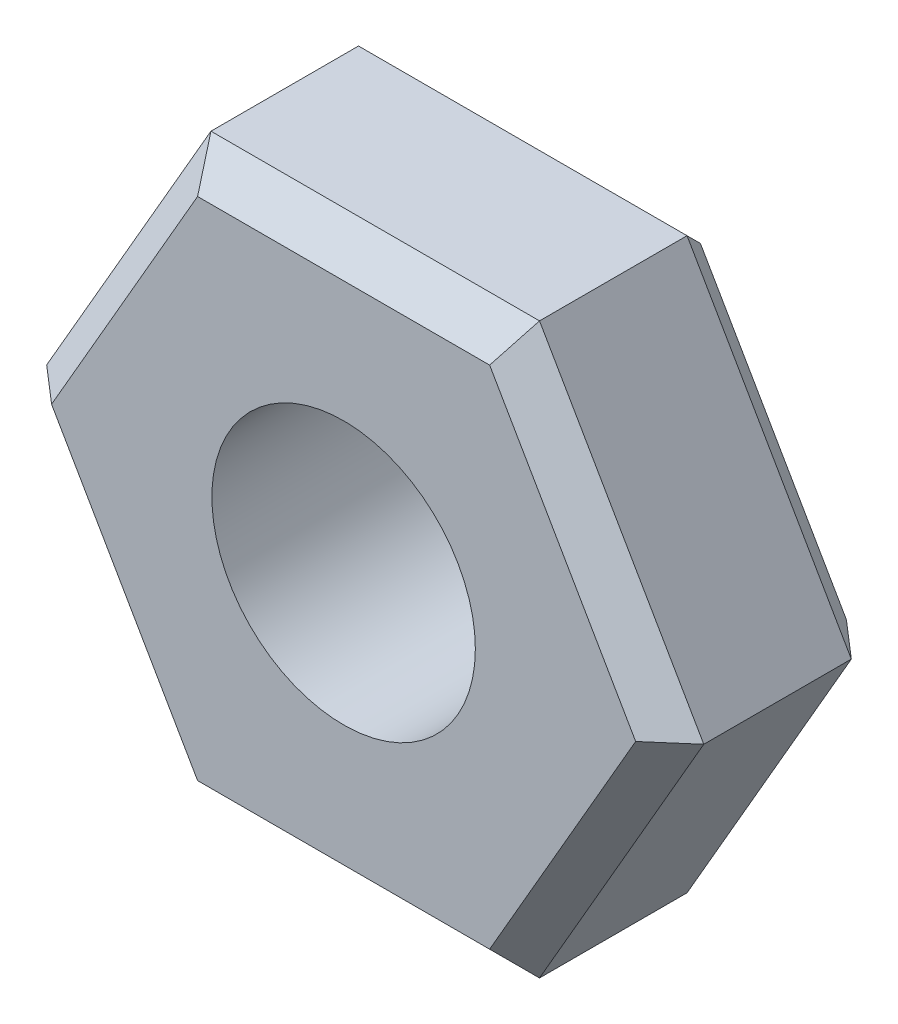
ISO-10303-21;
HEADER;
FILE_DESCRIPTION(('STEP AP214'),'2;1');
FILE_NAME('part.step','',(''),(''),'','','');
FILE_SCHEMA(('AUTOMOTIVE_DESIGN { 1 0 10303 214 1 1 1 1 }'));
ENDSEC;
DATA;
#1=APPLICATION_CONTEXT('core data for automotive mechanical design processes');
#2=APPLICATION_PROTOCOL_DEFINITION('international standard','automotive_design',2000,#1);
#3=PRODUCT_CONTEXT('',#1,'mechanical');
#4=PRODUCT('Part','Part','',(#3));
#5=PRODUCT_RELATED_PRODUCT_CATEGORY('part','',(#4));
#6=PRODUCT_DEFINITION_FORMATION('','',#4);
#7=PRODUCT_DEFINITION_CONTEXT('part definition',#1,'design');
#8=PRODUCT_DEFINITION('design','',#6,#7);
#9=PRODUCT_DEFINITION_SHAPE('','',#8);
#10=(LENGTH_UNIT() NAMED_UNIT(*) SI_UNIT(.MILLI.,.METRE.));
#11=(NAMED_UNIT(*) PLANE_ANGLE_UNIT() SI_UNIT($,.RADIAN.));
#12=(NAMED_UNIT(*) SI_UNIT($,.STERADIAN.) SOLID_ANGLE_UNIT());
#13=UNCERTAINTY_MEASURE_WITH_UNIT(LENGTH_MEASURE(1.E-05),#10,'distance_accuracy_value','');
#14=(GEOMETRIC_REPRESENTATION_CONTEXT(3) GLOBAL_UNCERTAINTY_ASSIGNED_CONTEXT((#13)) GLOBAL_UNIT_ASSIGNED_CONTEXT((#10,
#11,#12)) REPRESENTATION_CONTEXT('',''));
#15=CARTESIAN_POINT('',(0.,0.,0.));
#16=DIRECTION('',(0.,0.,1.));
#17=DIRECTION('',(1.,0.,0.));
#18=AXIS2_PLACEMENT_3D('',#15,#16,#17);
#19=CARTESIAN_POINT('',(0.,0.,1.));
#20=DIRECTION('',(0.,0.,1.));
#21=DIRECTION('',(1.,0.,0.));
#22=AXIS2_PLACEMENT_3D('',#19,#20,#21);
#23=PLANE('',#22);
#24=DIRECTION('',(-1.,0.,0.));
#25=VECTOR('',#24,1.);
#26=CARTESIAN_POINT('',(-1.558845726812,2.39999999999999,1.));
#27=LINE('',#26,#25);
#28=CARTESIAN_POINT('',(1.3856406460551,2.4,1.));
#29=VERTEX_POINT('',#28);
#30=CARTESIAN_POINT('',(-1.38564064605511,2.39999999999999,1.));
#31=VERTEX_POINT('',#30);
#32=EDGE_CURVE('E165',#29,#31,#27,.T.);
#33=ORIENTED_EDGE('',*,*,#32,.T.);
#34=DIRECTION('',(-0.499999999999995,-0.866025403784442,0.));
#35=VECTOR('',#34,1.);
#36=CARTESIAN_POINT('',(-2.85788383248865,-0.15000000000002,1.));
#37=LINE('',#36,#35);
#38=CARTESIAN_POINT('',(-2.7712812921102,0.,1.));
#39=VERTEX_POINT('',#38);
#40=EDGE_CURVE('E11',#31,#39,#37,.T.);
#41=ORIENTED_EDGE('',*,*,#40,.T.);
#42=DIRECTION('',(0.500000000000007,-0.866025403784435,0.));
#43=VECTOR('',#42,1.);
#44=CARTESIAN_POINT('',(-1.29903810567663,-2.55000000000001,1.));
#45=LINE('',#44,#43);
#46=CARTESIAN_POINT('',(-1.38564064605508,-2.40000000000001,1.));
#47=VERTEX_POINT('',#46);
#48=EDGE_CURVE('E48',#39,#47,#45,.T.);
#49=ORIENTED_EDGE('',*,*,#48,.T.);
#50=DIRECTION('',(1.,0.,0.));
#51=VECTOR('',#50,1.);
#52=CARTESIAN_POINT('',(1.55884572681202,-2.39999999999998,1.));
#53=LINE('',#52,#51);
#54=CARTESIAN_POINT('',(1.38564064605513,-2.39999999999998,1.));
#55=VERTEX_POINT('',#54);
#56=EDGE_CURVE('E194',#47,#55,#53,.T.);
#57=ORIENTED_EDGE('',*,*,#56,.T.);
#58=DIRECTION('',(0.499999999999995,0.866025403784441,0.));
#59=VECTOR('',#58,1.);
#60=CARTESIAN_POINT('',(2.85788383248865,0.149999999999999,1.));
#61=LINE('',#60,#59);
#62=CARTESIAN_POINT('',(2.77128129211021,0.,1.));
#63=VERTEX_POINT('',#62);
#64=EDGE_CURVE('E196',#55,#63,#61,.T.);
#65=ORIENTED_EDGE('',*,*,#64,.T.);
#66=DIRECTION('',(-0.500000000000001,0.866025403784438,0.));
#67=VECTOR('',#66,1.);
#68=CARTESIAN_POINT('',(1.29903810567665,2.55,1.));
#69=LINE('',#68,#67);
#70=EDGE_CURVE('E198',#63,#29,#69,.T.);
#71=ORIENTED_EDGE('',*,*,#70,.T.);
#72=EDGE_LOOP('',(#33,#41,#49,#57,#65,#71));
#73=FACE_BOUND('',#72,.T.);
#74=CARTESIAN_POINT('',(0.,0.,1.));
#75=DIRECTION('',(0.,0.,1.));
#76=DIRECTION('',(1.,0.,0.));
#77=AXIS2_PLACEMENT_3D('',#74,#75,#76);
#78=CIRCLE('',#77,1.25);
#79=CARTESIAN_POINT('',(1.25,0.,1.));
#80=VERTEX_POINT('',#79);
#81=EDGE_CURVE('E242',#80,#80,#78,.T.);
#82=ORIENTED_EDGE('',*,*,#81,.F.);
#83=EDGE_LOOP('',(#82));
#84=FACE_BOUND('',#83,.T.);
#85=ADVANCED_FACE('F38',(#73,#84),#23,.T.);
#86=CARTESIAN_POINT('',(0.,0.,-1.));
#87=DIRECTION('',(0.,0.,1.));
#88=DIRECTION('',(1.,0.,0.));
#89=AXIS2_PLACEMENT_3D('',#86,#87,#88);
#90=PLANE('',#89);
#91=DIRECTION('',(1.,0.,0.));
#92=VECTOR('',#91,1.);
#93=CARTESIAN_POINT('',(0.,2.4,-1.));
#94=LINE('',#93,#92);
#95=CARTESIAN_POINT('',(-1.38564064605511,2.39999999999999,-1.));
#96=VERTEX_POINT('',#95);
#97=CARTESIAN_POINT('',(1.3856406460551,2.4,-1.));
#98=VERTEX_POINT('',#97);
#99=EDGE_CURVE('E228',#96,#98,#94,.T.);
#100=ORIENTED_EDGE('',*,*,#99,.T.);
#101=DIRECTION('',(0.500000000000001,-0.866025403784438,0.));
#102=VECTOR('',#101,1.);
#103=CARTESIAN_POINT('',(2.07846096908265,1.2,-1.));
#104=LINE('',#103,#102);
#105=CARTESIAN_POINT('',(2.77128129211021,0.,-1.));
#106=VERTEX_POINT('',#105);
#107=EDGE_CURVE('E217',#98,#106,#104,.T.);
#108=ORIENTED_EDGE('',*,*,#107,.T.);
#109=DIRECTION('',(-0.499999999999995,-0.866025403784441,0.));
#110=VECTOR('',#109,1.);
#111=CARTESIAN_POINT('',(2.07846096908267,-1.19999999999999,-1.));
#112=LINE('',#111,#110);
#113=CARTESIAN_POINT('',(1.38564064605513,-2.39999999999998,-1.));
#114=VERTEX_POINT('',#113);
#115=EDGE_CURVE('E220',#106,#114,#112,.T.);
#116=ORIENTED_EDGE('',*,*,#115,.T.);
#117=DIRECTION('',(-1.,0.,0.));
#118=VECTOR('',#117,1.);
#119=CARTESIAN_POINT('',(0.,-2.4,-1.));
#120=LINE('',#119,#118);
#121=CARTESIAN_POINT('',(-1.38564064605508,-2.40000000000001,-1.));
#122=VERTEX_POINT('',#121);
#123=EDGE_CURVE('E222',#114,#122,#120,.T.);
#124=ORIENTED_EDGE('',*,*,#123,.T.);
#125=DIRECTION('',(-0.500000000000007,0.866025403784435,0.));
#126=VECTOR('',#125,1.);
#127=CARTESIAN_POINT('',(-2.07846096908264,-1.20000000000002,-1.));
#128=LINE('',#127,#126);
#129=CARTESIAN_POINT('',(-2.7712812921102,0.,-1.));
#130=VERTEX_POINT('',#129);
#131=EDGE_CURVE('E224',#122,#130,#128,.T.);
#132=ORIENTED_EDGE('',*,*,#131,.T.);
#133=DIRECTION('',(0.499999999999995,0.866025403784442,0.));
#134=VECTOR('',#133,1.);
#135=CARTESIAN_POINT('',(-2.07846096908266,1.19999999999999,-1.));
#136=LINE('',#135,#134);
#137=EDGE_CURVE('E226',#130,#96,#136,.T.);
#138=ORIENTED_EDGE('',*,*,#137,.T.);
#139=EDGE_LOOP('',(#100,#108,#116,#124,#132,#138));
#140=FACE_BOUND('',#139,.T.);
#141=CARTESIAN_POINT('',(0.,0.,-1.));
#142=DIRECTION('',(0.,0.,1.));
#143=DIRECTION('',(1.,0.,0.));
#144=AXIS2_PLACEMENT_3D('',#141,#142,#143);
#145=CIRCLE('',#144,1.25);
#146=CARTESIAN_POINT('',(1.25,0.,-1.));
#147=VERTEX_POINT('',#146);
#148=EDGE_CURVE('E179',#147,#147,#145,.T.);
#149=ORIENTED_EDGE('',*,*,#148,.T.);
#150=EDGE_LOOP('',(#149));
#151=FACE_BOUND('',#150,.T.);
#152=ADVANCED_FACE('F252',(#140,#151),#90,.F.);
#153=CARTESIAN_POINT('',(1.55884572681202,-2.69999999999998,1.));
#154=DIRECTION('',(-0.866025403784441,0.499999999999995,0.));
#155=DIRECTION('',(-0.499999999999995,-0.866025403784442,0.));
#156=AXIS2_PLACEMENT_3D('',#153,#154,#155);
#157=PLANE('',#156);
#158=DIRECTION('',(0.,0.,-1.));
#159=VECTOR('',#158,1.);
#160=CARTESIAN_POINT('',(1.55884572681202,-2.69999999999998,1.));
#161=LINE('',#160,#159);
#162=CARTESIAN_POINT('',(1.55884572681202,-2.69999999999998,0.699999999999999));
#163=VERTEX_POINT('',#162);
#164=CARTESIAN_POINT('',(1.55884572681202,-2.69999999999998,-0.7));
#165=VERTEX_POINT('',#164);
#166=EDGE_CURVE('E239',#163,#165,#161,.T.);
#167=ORIENTED_EDGE('',*,*,#166,.T.);
#168=DIRECTION('',(0.499999999999995,0.866025403784442,0.));
#169=VECTOR('',#168,1.);
#170=CARTESIAN_POINT('',(1.55884572681202,-2.69999999999998,-0.7));
#171=LINE('',#170,#169);
#172=CARTESIAN_POINT('',(3.11769145362398,0.,-0.7));
#173=VERTEX_POINT('',#172);
#174=EDGE_CURVE('E213',#165,#173,#171,.T.);
#175=ORIENTED_EDGE('',*,*,#174,.T.);
#176=DIRECTION('',(0.,0.,-1.));
#177=VECTOR('',#176,1.);
#178=CARTESIAN_POINT('',(3.11769145362398,0.,1.));
#179=LINE('',#178,#177);
#180=CARTESIAN_POINT('',(3.11769145362398,0.,0.699999999999999));
#181=VERTEX_POINT('',#180);
#182=EDGE_CURVE('E153',#181,#173,#179,.T.);
#183=ORIENTED_EDGE('',*,*,#182,.F.);
#184=DIRECTION('',(-0.499999999999995,-0.866025403784442,0.));
#185=VECTOR('',#184,1.);
#186=CARTESIAN_POINT('',(1.55884572681202,-2.69999999999998,0.699999999999999));
#187=LINE('',#186,#185);
#188=EDGE_CURVE('E215',#181,#163,#187,.T.);
#189=ORIENTED_EDGE('',*,*,#188,.T.);
#190=EDGE_LOOP('',(#167,#175,#183,#189));
#191=FACE_BOUND('',#190,.T.);
#192=ADVANCED_FACE('F257',(#191),#157,.F.);
#193=CARTESIAN_POINT('',(3.11769145362398,0.,1.));
#194=DIRECTION('',(-0.866025403784438,-0.500000000000001,0.));
#195=DIRECTION('',(0.500000000000001,-0.866025403784438,0.));
#196=AXIS2_PLACEMENT_3D('',#193,#194,#195);
#197=PLANE('',#196);
#198=ORIENTED_EDGE('',*,*,#182,.T.);
#199=DIRECTION('',(-0.500000000000001,0.866025403784438,0.));
#200=VECTOR('',#199,1.);
#201=CARTESIAN_POINT('',(3.11769145362398,0.,-0.7));
#202=LINE('',#201,#200);
#203=CARTESIAN_POINT('',(1.55884572681198,2.70000000000001,-0.7));
#204=VERTEX_POINT('',#203);
#205=EDGE_CURVE('E152',#173,#204,#202,.T.);
#206=ORIENTED_EDGE('',*,*,#205,.T.);
#207=DIRECTION('',(0.,0.,-1.));
#208=VECTOR('',#207,1.);
#209=CARTESIAN_POINT('',(1.55884572681198,2.70000000000001,1.));
#210=LINE('',#209,#208);
#211=CARTESIAN_POINT('',(1.55884572681198,2.70000000000001,0.699999999999999));
#212=VERTEX_POINT('',#211);
#213=EDGE_CURVE('E134',#212,#204,#210,.T.);
#214=ORIENTED_EDGE('',*,*,#213,.F.);
#215=DIRECTION('',(0.500000000000001,-0.866025403784438,0.));
#216=VECTOR('',#215,1.);
#217=CARTESIAN_POINT('',(3.11769145362398,0.,0.699999999999999));
#218=LINE('',#217,#216);
#219=EDGE_CURVE('E149',#212,#181,#218,.T.);
#220=ORIENTED_EDGE('',*,*,#219,.T.);
#221=EDGE_LOOP('',(#198,#206,#214,#220));
#222=FACE_BOUND('',#221,.T.);
#223=ADVANCED_FACE('F148',(#222),#197,.F.);
#224=CARTESIAN_POINT('',(1.55884572681198,2.70000000000001,1.));
#225=DIRECTION('',(0.,-1.,0.));
#226=DIRECTION('',(1.,0.,0.));
#227=AXIS2_PLACEMENT_3D('',#224,#225,#226);
#228=PLANE('',#227);
#229=ORIENTED_EDGE('',*,*,#213,.T.);
#230=DIRECTION('',(-1.,0.,0.));
#231=VECTOR('',#230,1.);
#232=CARTESIAN_POINT('',(1.55884572681198,2.70000000000001,-0.7));
#233=LINE('',#232,#231);
#234=CARTESIAN_POINT('',(-1.558845726812,2.69999999999999,-0.7));
#235=VERTEX_POINT('',#234);
#236=EDGE_CURVE('E141',#204,#235,#233,.T.);
#237=ORIENTED_EDGE('',*,*,#236,.T.);
#238=DIRECTION('',(0.,0.,-1.));
#239=VECTOR('',#238,1.);
#240=CARTESIAN_POINT('',(-1.558845726812,2.69999999999999,1.));
#241=LINE('',#240,#239);
#242=CARTESIAN_POINT('',(-1.558845726812,2.69999999999999,0.699999999999999));
#243=VERTEX_POINT('',#242);
#244=EDGE_CURVE('E136',#243,#235,#241,.T.);
#245=ORIENTED_EDGE('',*,*,#244,.F.);
#246=DIRECTION('',(1.,0.,0.));
#247=VECTOR('',#246,1.);
#248=CARTESIAN_POINT('',(1.55884572681198,2.70000000000001,0.699999999999999));
#249=LINE('',#248,#247);
#250=EDGE_CURVE('E131',#243,#212,#249,.T.);
#251=ORIENTED_EDGE('',*,*,#250,.T.);
#252=EDGE_LOOP('',(#229,#237,#245,#251));
#253=FACE_BOUND('',#252,.T.);
#254=ADVANCED_FACE('F133',(#253),#228,.F.);
#255=CARTESIAN_POINT('',(-1.558845726812,2.69999999999999,1.));
#256=DIRECTION('',(0.866025403784442,-0.499999999999995,0.));
#257=DIRECTION('',(0.499999999999995,0.866025403784442,0.));
#258=AXIS2_PLACEMENT_3D('',#255,#256,#257);
#259=PLANE('',#258);
#260=ORIENTED_EDGE('',*,*,#244,.T.);
#261=DIRECTION('',(-0.499999999999995,-0.866025403784442,0.));
#262=VECTOR('',#261,1.);
#263=CARTESIAN_POINT('',(-1.558845726812,2.69999999999999,-0.7));
#264=LINE('',#263,#262);
#265=CARTESIAN_POINT('',(-3.11769145362398,0.,-0.7));
#266=VERTEX_POINT('',#265);
#267=EDGE_CURVE('E142',#235,#266,#264,.T.);
#268=ORIENTED_EDGE('',*,*,#267,.T.);
#269=DIRECTION('',(0.,0.,-1.));
#270=VECTOR('',#269,1.);
#271=CARTESIAN_POINT('',(-3.11769145362398,0.,1.));
#272=LINE('',#271,#270);
#273=CARTESIAN_POINT('',(-3.11769145362398,0.,0.699999999999999));
#274=VERTEX_POINT('',#273);
#275=EDGE_CURVE('E233',#274,#266,#272,.T.);
#276=ORIENTED_EDGE('',*,*,#275,.F.);
#277=DIRECTION('',(0.499999999999995,0.866025403784442,0.));
#278=VECTOR('',#277,1.);
#279=CARTESIAN_POINT('',(-1.558845726812,2.69999999999999,0.699999999999999));
#280=LINE('',#279,#278);
#281=EDGE_CURVE('E203',#274,#243,#280,.T.);
#282=ORIENTED_EDGE('',*,*,#281,.T.);
#283=EDGE_LOOP('',(#260,#268,#276,#282));
#284=FACE_BOUND('',#283,.T.);
#285=ADVANCED_FACE('F269',(#284),#259,.F.);
#286=CARTESIAN_POINT('',(-3.11769145362398,0.,1.));
#287=DIRECTION('',(0.866025403784435,0.500000000000007,0.));
#288=DIRECTION('',(-0.500000000000007,0.866025403784435,0.));
#289=AXIS2_PLACEMENT_3D('',#286,#287,#288);
#290=PLANE('',#289);
#291=ORIENTED_EDGE('',*,*,#275,.T.);
#292=DIRECTION('',(0.500000000000007,-0.866025403784435,0.));
#293=VECTOR('',#292,1.);
#294=CARTESIAN_POINT('',(-3.11769145362398,0.,-0.7));
#295=LINE('',#294,#293);
#296=CARTESIAN_POINT('',(-1.55884572681197,-2.70000000000002,-0.7));
#297=VERTEX_POINT('',#296);
#298=EDGE_CURVE('E205',#266,#297,#295,.T.);
#299=ORIENTED_EDGE('',*,*,#298,.T.);
#300=DIRECTION('',(0.,0.,-1.));
#301=VECTOR('',#300,1.);
#302=CARTESIAN_POINT('',(-1.55884572681197,-2.70000000000002,1.));
#303=LINE('',#302,#301);
#304=CARTESIAN_POINT('',(-1.55884572681197,-2.70000000000002,0.699999999999999));
#305=VERTEX_POINT('',#304);
#306=EDGE_CURVE('E236',#305,#297,#303,.T.);
#307=ORIENTED_EDGE('',*,*,#306,.F.);
#308=DIRECTION('',(-0.500000000000007,0.866025403784435,0.));
#309=VECTOR('',#308,1.);
#310=CARTESIAN_POINT('',(-3.11769145362398,0.,0.699999999999999));
#311=LINE('',#310,#309);
#312=EDGE_CURVE('E207',#305,#274,#311,.T.);
#313=ORIENTED_EDGE('',*,*,#312,.T.);
#314=EDGE_LOOP('',(#291,#299,#307,#313));
#315=FACE_BOUND('',#314,.T.);
#316=ADVANCED_FACE('F265',(#315),#290,.F.);
#317=CARTESIAN_POINT('',(-1.55884572681197,-2.70000000000002,1.));
#318=DIRECTION('',(0.,1.,0.));
#319=DIRECTION('',(-1.,0.,0.));
#320=AXIS2_PLACEMENT_3D('',#317,#318,#319);
#321=PLANE('',#320);
#322=ORIENTED_EDGE('',*,*,#306,.T.);
#323=DIRECTION('',(1.,0.,0.));
#324=VECTOR('',#323,1.);
#325=CARTESIAN_POINT('',(-1.55884572681197,-2.70000000000002,-0.7));
#326=LINE('',#325,#324);
#327=EDGE_CURVE('E209',#297,#165,#326,.T.);
#328=ORIENTED_EDGE('',*,*,#327,.T.);
#329=ORIENTED_EDGE('',*,*,#166,.F.);
#330=DIRECTION('',(-1.,0.,0.));
#331=VECTOR('',#330,1.);
#332=CARTESIAN_POINT('',(-1.55884572681197,-2.70000000000002,0.699999999999999));
#333=LINE('',#332,#331);
#334=EDGE_CURVE('E211',#163,#305,#333,.T.);
#335=ORIENTED_EDGE('',*,*,#334,.T.);
#336=EDGE_LOOP('',(#322,#328,#329,#335));
#337=FACE_BOUND('',#336,.T.);
#338=ADVANCED_FACE('F262',(#337),#321,.F.);
#339=CARTESIAN_POINT('',(0.,0.,1.));
#340=DIRECTION('',(0.,0.,-1.));
#341=DIRECTION('',(-1.,0.,0.));
#342=AXIS2_PLACEMENT_3D('',#339,#340,#341);
#343=CYLINDRICAL_SURFACE('',#342,1.25);
#344=ORIENTED_EDGE('',*,*,#81,.T.);
#345=EDGE_LOOP('',(#344));
#346=FACE_BOUND('',#345,.T.);
#347=ORIENTED_EDGE('',*,*,#148,.F.);
#348=EDGE_LOOP('',(#347));
#349=FACE_BOUND('',#348,.T.);
#350=ADVANCED_FACE('F248',(#346,#349),#343,.F.);
#351=CARTESIAN_POINT('',(-3.11769145362398,0.,-0.7));
#352=DIRECTION('',(0.612372435695791,0.353553390593278,0.707106781186549));
#353=DIRECTION('',(0.500000000000007,-0.866025403784435,0.));
#354=AXIS2_PLACEMENT_3D('',#351,#352,#353);
#355=PLANE('',#354);
#356=DIRECTION('',(-0.755928946018456,0.,0.654653670707976));
#357=VECTOR('',#356,1.);
#358=CARTESIAN_POINT('',(-2.22692246687426,0.,-1.47142857142858));
#359=LINE('',#358,#357);
#360=EDGE_CURVE('E180',#130,#266,#359,.T.);
#361=ORIENTED_EDGE('',*,*,#360,.F.);
#362=ORIENTED_EDGE('',*,*,#131,.F.);
#363=DIRECTION('',(-0.377964473009222,-0.654653670707982,0.654653670707976));
#364=VECTOR('',#363,1.);
#365=CARTESIAN_POINT('',(-1.11346123343711,-1.92857142857144,-1.47142857142857));
#366=LINE('',#365,#364);
#367=EDGE_CURVE('E176',#297,#122,#366,.F.);
#368=ORIENTED_EDGE('',*,*,#367,.F.);
#369=ORIENTED_EDGE('',*,*,#298,.F.);
#370=EDGE_LOOP('',(#361,#362,#368,#369));
#371=FACE_BOUND('',#370,.T.);
#372=ADVANCED_FACE('F316',(#371),#355,.F.);
#373=CARTESIAN_POINT('',(-1.55884572681197,-2.70000000000002,-0.7));
#374=DIRECTION('',(0.,0.707106781186547,0.707106781186549));
#375=DIRECTION('',(1.,0.,0.));
#376=AXIS2_PLACEMENT_3D('',#373,#374,#375);
#377=PLANE('',#376);
#378=ORIENTED_EDGE('',*,*,#367,.T.);
#379=ORIENTED_EDGE('',*,*,#123,.F.);
#380=DIRECTION('',(0.377964473009233,-0.654653670707974,0.654653670707976));
#381=VECTOR('',#380,1.);
#382=CARTESIAN_POINT('',(1.11346123343716,-1.92857142857142,-1.47142857142857));
#383=LINE('',#382,#381);
#384=EDGE_CURVE('E183',#165,#114,#383,.F.);
#385=ORIENTED_EDGE('',*,*,#384,.F.);
#386=ORIENTED_EDGE('',*,*,#327,.F.);
#387=EDGE_LOOP('',(#378,#379,#385,#386));
#388=FACE_BOUND('',#387,.T.);
#389=ADVANCED_FACE('F309',(#388),#377,.F.);
#390=CARTESIAN_POINT('',(-1.558845726812,2.69999999999999,-0.7));
#391=DIRECTION('',(0.612372435695796,-0.35355339059327,0.707106781186548));
#392=DIRECTION('',(-0.499999999999995,-0.866025403784442,0.));
#393=AXIS2_PLACEMENT_3D('',#390,#391,#392);
#394=PLANE('',#393);
#395=ORIENTED_EDGE('',*,*,#360,.T.);
#396=ORIENTED_EDGE('',*,*,#267,.F.);
#397=DIRECTION('',(-0.37796447300923,0.654653670707976,0.654653670707976));
#398=VECTOR('',#397,1.);
#399=CARTESIAN_POINT('',(-1.11346123343714,1.92857142857142,-1.47142857142857));
#400=LINE('',#399,#398);
#401=EDGE_CURVE('E186',#96,#235,#400,.T.);
#402=ORIENTED_EDGE('',*,*,#401,.F.);
#403=ORIENTED_EDGE('',*,*,#137,.F.);
#404=EDGE_LOOP('',(#395,#396,#402,#403));
#405=FACE_BOUND('',#404,.T.);
#406=ADVANCED_FACE('F302',(#405),#394,.F.);
#407=CARTESIAN_POINT('',(1.55884572681202,-2.69999999999998,-0.7));
#408=DIRECTION('',(-0.612372435695795,0.35355339059327,0.707106781186549));
#409=DIRECTION('',(0.499999999999995,0.866025403784442,0.));
#410=AXIS2_PLACEMENT_3D('',#407,#408,#409);
#411=PLANE('',#410);
#412=ORIENTED_EDGE('',*,*,#384,.T.);
#413=ORIENTED_EDGE('',*,*,#115,.F.);
#414=DIRECTION('',(0.755928946018455,0.,0.654653670707976));
#415=VECTOR('',#414,1.);
#416=CARTESIAN_POINT('',(2.22692246687428,0.,-1.47142857142856));
#417=LINE('',#416,#415);
#418=EDGE_CURVE('E189',#173,#106,#417,.F.);
#419=ORIENTED_EDGE('',*,*,#418,.F.);
#420=ORIENTED_EDGE('',*,*,#174,.F.);
#421=EDGE_LOOP('',(#412,#413,#419,#420));
#422=FACE_BOUND('',#421,.T.);
#423=ADVANCED_FACE('F295',(#422),#411,.F.);
#424=CARTESIAN_POINT('',(1.55884572681198,2.70000000000001,-0.7));
#425=DIRECTION('',(0.,-0.707106781186547,0.707106781186549));
#426=DIRECTION('',(-1.,0.,0.));
#427=AXIS2_PLACEMENT_3D('',#424,#425,#426);
#428=PLANE('',#427);
#429=ORIENTED_EDGE('',*,*,#401,.T.);
#430=ORIENTED_EDGE('',*,*,#236,.F.);
#431=DIRECTION('',(-0.377964473009226,-0.654653670707979,-0.654653670707976));
#432=VECTOR('',#431,1.);
#433=CARTESIAN_POINT('',(1.55884572681198,2.70000000000001,-0.7));
#434=LINE('',#433,#432);
#435=EDGE_CURVE('E191',#98,#204,#434,.F.);
#436=ORIENTED_EDGE('',*,*,#435,.F.);
#437=ORIENTED_EDGE('',*,*,#99,.F.);
#438=EDGE_LOOP('',(#429,#430,#436,#437));
#439=FACE_BOUND('',#438,.T.);
#440=ADVANCED_FACE('F288',(#439),#428,.F.);
#441=CARTESIAN_POINT('',(3.11769145362398,0.,-0.7));
#442=DIRECTION('',(-0.612372435695793,-0.353553390593274,0.707106781186549));
#443=DIRECTION('',(-0.500000000000001,0.866025403784438,0.));
#444=AXIS2_PLACEMENT_3D('',#441,#442,#443);
#445=PLANE('',#444);
#446=ORIENTED_EDGE('',*,*,#418,.T.);
#447=ORIENTED_EDGE('',*,*,#107,.F.);
#448=ORIENTED_EDGE('',*,*,#435,.T.);
#449=ORIENTED_EDGE('',*,*,#205,.F.);
#450=EDGE_LOOP('',(#446,#447,#448,#449));
#451=FACE_BOUND('',#450,.T.);
#452=ADVANCED_FACE('F282',(#451),#445,.F.);
#453=CARTESIAN_POINT('',(2.07846096908267,-1.19999999999999,1.));
#454=DIRECTION('',(0.612372435695796,-0.35355339059327,0.707106781186548));
#455=DIRECTION('',(-0.499999999999995,-0.866025403784442,0.));
#456=AXIS2_PLACEMENT_3D('',#453,#454,#455);
#457=PLANE('',#456);
#458=DIRECTION('',(0.377964473009233,-0.654653670707974,-0.654653670707978));
#459=VECTOR('',#458,1.);
#460=CARTESIAN_POINT('',(1.18769198233297,-2.05714285714285,1.34285714285714));
#461=LINE('',#460,#459);
#462=EDGE_CURVE('E166',#163,#55,#461,.F.);
#463=ORIENTED_EDGE('',*,*,#462,.F.);
#464=ORIENTED_EDGE('',*,*,#188,.F.);
#465=DIRECTION('',(0.755928946018454,0.,-0.654653670707977));
#466=VECTOR('',#465,1.);
#467=CARTESIAN_POINT('',(2.37538396466589,0.,1.34285714285714));
#468=LINE('',#467,#466);
#469=EDGE_CURVE('E43',#63,#181,#468,.T.);
#470=ORIENTED_EDGE('',*,*,#469,.F.);
#471=ORIENTED_EDGE('',*,*,#64,.F.);
#472=EDGE_LOOP('',(#463,#464,#470,#471));
#473=FACE_BOUND('',#472,.T.);
#474=ADVANCED_FACE('F41',(#473),#457,.T.);
#475=CARTESIAN_POINT('',(2.07846096908265,1.2,1.));
#476=DIRECTION('',(0.612372435695794,0.353553390593274,0.707106781186547));
#477=DIRECTION('',(0.500000000000001,-0.866025403784438,0.));
#478=AXIS2_PLACEMENT_3D('',#475,#476,#477);
#479=PLANE('',#478);
#480=ORIENTED_EDGE('',*,*,#469,.T.);
#481=ORIENTED_EDGE('',*,*,#219,.F.);
#482=DIRECTION('',(0.377964473009226,0.654653670707978,-0.654653670707977));
#483=VECTOR('',#482,1.);
#484=CARTESIAN_POINT('',(1.18769198233294,2.05714285714286,1.34285714285714));
#485=LINE('',#484,#483);
#486=EDGE_CURVE('E160',#29,#212,#485,.T.);
#487=ORIENTED_EDGE('',*,*,#486,.F.);
#488=ORIENTED_EDGE('',*,*,#70,.F.);
#489=EDGE_LOOP('',(#480,#481,#487,#488));
#490=FACE_BOUND('',#489,.T.);
#491=ADVANCED_FACE('F158',(#490),#479,.T.);
#492=CARTESIAN_POINT('',(0.,-2.4,1.));
#493=DIRECTION('',(0.,-0.707106781186547,0.707106781186547));
#494=DIRECTION('',(-1.,0.,0.));
#495=AXIS2_PLACEMENT_3D('',#492,#493,#494);
#496=PLANE('',#495);
#497=ORIENTED_EDGE('',*,*,#462,.T.);
#498=ORIENTED_EDGE('',*,*,#56,.F.);
#499=DIRECTION('',(-0.377964473009221,-0.654653670707981,-0.654653670707977));
#500=VECTOR('',#499,1.);
#501=CARTESIAN_POINT('',(-1.18769198233292,-2.05714285714287,1.34285714285714));
#502=LINE('',#501,#500);
#503=EDGE_CURVE('E167',#305,#47,#502,.F.);
#504=ORIENTED_EDGE('',*,*,#503,.F.);
#505=ORIENTED_EDGE('',*,*,#334,.F.);
#506=EDGE_LOOP('',(#497,#498,#504,#505));
#507=FACE_BOUND('',#506,.T.);
#508=ADVANCED_FACE('F342',(#507),#496,.T.);
#509=CARTESIAN_POINT('',(0.,2.4,1.));
#510=DIRECTION('',(0.,0.707106781186547,0.707106781186547));
#511=DIRECTION('',(1.,0.,0.));
#512=AXIS2_PLACEMENT_3D('',#509,#510,#511);
#513=PLANE('',#512);
#514=ORIENTED_EDGE('',*,*,#486,.T.);
#515=ORIENTED_EDGE('',*,*,#250,.F.);
#516=DIRECTION('',(0.37796447300923,-0.654653670707976,0.654653670707977));
#517=VECTOR('',#516,1.);
#518=CARTESIAN_POINT('',(-1.18769198233295,2.05714285714285,1.34285714285714));
#519=LINE('',#518,#517);
#520=EDGE_CURVE('E171',#31,#243,#519,.F.);
#521=ORIENTED_EDGE('',*,*,#520,.F.);
#522=ORIENTED_EDGE('',*,*,#32,.F.);
#523=EDGE_LOOP('',(#514,#515,#521,#522));
#524=FACE_BOUND('',#523,.T.);
#525=ADVANCED_FACE('F164',(#524),#513,.T.);
#526=CARTESIAN_POINT('',(-2.07846096908264,-1.20000000000002,1.));
#527=DIRECTION('',(-0.612372435695792,-0.353553390593279,0.707106781186548));
#528=DIRECTION('',(-0.500000000000007,0.866025403784435,0.));
#529=AXIS2_PLACEMENT_3D('',#526,#527,#528);
#530=PLANE('',#529);
#531=ORIENTED_EDGE('',*,*,#503,.T.);
#532=ORIENTED_EDGE('',*,*,#48,.F.);
#533=DIRECTION('',(-0.755928946018455,0.,-0.654653670707977));
#534=VECTOR('',#533,1.);
#535=CARTESIAN_POINT('',(-2.37538396466589,0.,1.34285714285714));
#536=LINE('',#535,#534);
#537=EDGE_CURVE('E56',#274,#39,#536,.F.);
#538=ORIENTED_EDGE('',*,*,#537,.F.);
#539=ORIENTED_EDGE('',*,*,#312,.F.);
#540=EDGE_LOOP('',(#531,#532,#538,#539));
#541=FACE_BOUND('',#540,.T.);
#542=ADVANCED_FACE('F330',(#541),#530,.T.);
#543=CARTESIAN_POINT('',(-2.07846096908266,1.19999999999999,1.));
#544=DIRECTION('',(-0.612372435695797,0.35355339059327,0.707106781186547));
#545=DIRECTION('',(0.499999999999995,0.866025403784442,0.));
#546=AXIS2_PLACEMENT_3D('',#543,#544,#545);
#547=PLANE('',#546);
#548=ORIENTED_EDGE('',*,*,#520,.T.);
#549=ORIENTED_EDGE('',*,*,#281,.F.);
#550=ORIENTED_EDGE('',*,*,#537,.T.);
#551=ORIENTED_EDGE('',*,*,#40,.F.);
#552=EDGE_LOOP('',(#548,#549,#550,#551));
#553=FACE_BOUND('',#552,.T.);
#554=ADVANCED_FACE('F324',(#553),#547,.T.);
#555=CLOSED_SHELL('',(#85,#152,#192,#223,#254,#285,#316,#338,#350,#372,#389,#406,#423,#440,#452,
#474,#491,#508,#525,#542,#554));
#556=MANIFOLD_SOLID_BREP('B2',#555);
#557=ADVANCED_BREP_SHAPE_REPRESENTATION('',(#18,#556),#14);
#558=SHAPE_DEFINITION_REPRESENTATION(#9,#557);
ENDSEC;
END-ISO-10303-21;
